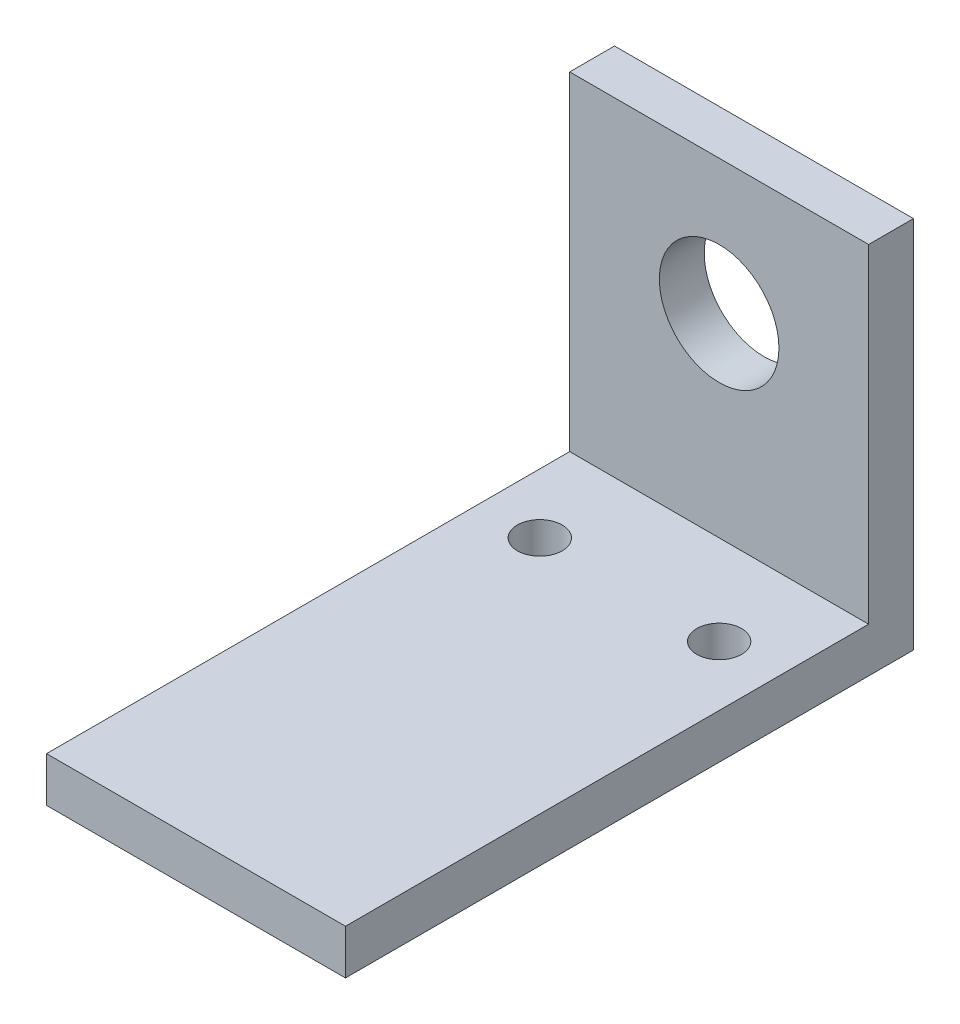
ISO-10303-21;
HEADER;
FILE_DESCRIPTION(('STEP AP214'),'2;1');
FILE_NAME('part.step','',(''),(''),'','','');
FILE_SCHEMA(('AUTOMOTIVE_DESIGN { 1 0 10303 214 1 1 1 1 }'));
ENDSEC;
DATA;
#1=APPLICATION_CONTEXT('core data for automotive mechanical design processes');
#2=APPLICATION_PROTOCOL_DEFINITION('international standard','automotive_design',2000,#1);
#3=PRODUCT_CONTEXT('',#1,'mechanical');
#4=PRODUCT('Part','Part','',(#3));
#5=PRODUCT_RELATED_PRODUCT_CATEGORY('part','',(#4));
#6=PRODUCT_DEFINITION_FORMATION('','',#4);
#7=PRODUCT_DEFINITION_CONTEXT('part definition',#1,'design');
#8=PRODUCT_DEFINITION('design','',#6,#7);
#9=PRODUCT_DEFINITION_SHAPE('','',#8);
#10=(LENGTH_UNIT() NAMED_UNIT(*) SI_UNIT(.MILLI.,.METRE.));
#11=(NAMED_UNIT(*) PLANE_ANGLE_UNIT() SI_UNIT($,.RADIAN.));
#12=(NAMED_UNIT(*) SI_UNIT($,.STERADIAN.) SOLID_ANGLE_UNIT());
#13=UNCERTAINTY_MEASURE_WITH_UNIT(LENGTH_MEASURE(1.E-05),#10,'distance_accuracy_value','');
#14=(GEOMETRIC_REPRESENTATION_CONTEXT(3) GLOBAL_UNCERTAINTY_ASSIGNED_CONTEXT((#13)) GLOBAL_UNIT_ASSIGNED_CONTEXT((#10,
#11,#12)) REPRESENTATION_CONTEXT('',''));
#15=CARTESIAN_POINT('',(0.,0.,0.));
#16=DIRECTION('',(0.,0.,1.));
#17=DIRECTION('',(1.,0.,0.));
#18=AXIS2_PLACEMENT_3D('',#15,#16,#17);
#19=CARTESIAN_POINT('',(20.,0.,35.));
#20=DIRECTION('',(0.,-1.,0.));
#21=DIRECTION('',(0.,0.,-1.));
#22=AXIS2_PLACEMENT_3D('',#19,#20,#21);
#23=PLANE('',#22);
#24=CARTESIAN_POINT('',(16.,0.,6.));
#25=DIRECTION('',(0.,1.,0.));
#26=DIRECTION('',(0.,0.,1.));
#27=AXIS2_PLACEMENT_3D('',#24,#25,#26);
#28=CIRCLE('',#27,1.5);
#29=CARTESIAN_POINT('',(16.,0.,7.5));
#30=VERTEX_POINT('',#29);
#31=EDGE_CURVE('E162',#30,#30,#28,.T.);
#32=ORIENTED_EDGE('',*,*,#31,.F.);
#33=EDGE_LOOP('',(#32));
#34=FACE_BOUND('',#33,.T.);
#35=CARTESIAN_POINT('',(4.,0.,6.));
#36=DIRECTION('',(0.,1.,0.));
#37=DIRECTION('',(0.,0.,1.));
#38=AXIS2_PLACEMENT_3D('',#35,#36,#37);
#39=CIRCLE('',#38,1.5);
#40=CARTESIAN_POINT('',(4.,0.,7.5));
#41=VERTEX_POINT('',#40);
#42=EDGE_CURVE('E165',#41,#41,#39,.T.);
#43=ORIENTED_EDGE('',*,*,#42,.F.);
#44=EDGE_LOOP('',(#43));
#45=FACE_BOUND('',#44,.T.);
#46=DIRECTION('',(0.,0.,1.));
#47=VECTOR('',#46,1.);
#48=CARTESIAN_POINT('',(0.,0.,35.));
#49=LINE('',#48,#47);
#50=CARTESIAN_POINT('',(0.,0.,0.));
#51=VERTEX_POINT('',#50);
#52=CARTESIAN_POINT('',(0.,0.,35.));
#53=VERTEX_POINT('',#52);
#54=EDGE_CURVE('E117',#51,#53,#49,.T.);
#55=ORIENTED_EDGE('',*,*,#54,.T.);
#56=DIRECTION('',(-1.,0.,0.));
#57=VECTOR('',#56,1.);
#58=CARTESIAN_POINT('',(20.,0.,35.));
#59=LINE('',#58,#57);
#60=CARTESIAN_POINT('',(20.,0.,35.));
#61=VERTEX_POINT('',#60);
#62=EDGE_CURVE('E11',#61,#53,#59,.T.);
#63=ORIENTED_EDGE('',*,*,#62,.F.);
#64=DIRECTION('',(0.,0.,1.));
#65=VECTOR('',#64,1.);
#66=CARTESIAN_POINT('',(20.,0.,35.));
#67=LINE('',#66,#65);
#68=CARTESIAN_POINT('',(20.,0.,0.));
#69=VERTEX_POINT('',#68);
#70=EDGE_CURVE('E128',#69,#61,#67,.T.);
#71=ORIENTED_EDGE('',*,*,#70,.F.);
#72=DIRECTION('',(-1.,0.,0.));
#73=VECTOR('',#72,1.);
#74=CARTESIAN_POINT('',(20.,0.,0.));
#75=LINE('',#74,#73);
#76=EDGE_CURVE('E113',#69,#51,#75,.T.);
#77=ORIENTED_EDGE('',*,*,#76,.T.);
#78=EDGE_LOOP('',(#55,#63,#71,#77));
#79=FACE_BOUND('',#78,.T.);
#80=ADVANCED_FACE('F33',(#34,#45,#79),#23,.F.);
#81=CARTESIAN_POINT('',(20.,-3.00000000000001,35.));
#82=DIRECTION('',(0.,0.,-1.));
#83=DIRECTION('',(-1.,0.,0.));
#84=AXIS2_PLACEMENT_3D('',#81,#82,#83);
#85=PLANE('',#84);
#86=DIRECTION('',(0.,-1.,0.));
#87=VECTOR('',#86,1.);
#88=CARTESIAN_POINT('',(0.,-3.00000000000001,35.));
#89=LINE('',#88,#87);
#90=CARTESIAN_POINT('',(0.,-3.00000000000001,35.));
#91=VERTEX_POINT('',#90);
#92=EDGE_CURVE('E120',#53,#91,#89,.T.);
#93=ORIENTED_EDGE('',*,*,#92,.T.);
#94=DIRECTION('',(-1.,0.,0.));
#95=VECTOR('',#94,1.);
#96=CARTESIAN_POINT('',(20.,-3.00000000000001,35.));
#97=LINE('',#96,#95);
#98=CARTESIAN_POINT('',(20.,-3.00000000000001,35.));
#99=VERTEX_POINT('',#98);
#100=EDGE_CURVE('E41',#99,#91,#97,.T.);
#101=ORIENTED_EDGE('',*,*,#100,.F.);
#102=DIRECTION('',(0.,-1.,0.));
#103=VECTOR('',#102,1.);
#104=CARTESIAN_POINT('',(20.,-3.00000000000001,35.));
#105=LINE('',#104,#103);
#106=EDGE_CURVE('E86',#61,#99,#105,.T.);
#107=ORIENTED_EDGE('',*,*,#106,.F.);
#108=ORIENTED_EDGE('',*,*,#62,.T.);
#109=EDGE_LOOP('',(#93,#101,#107,#108));
#110=FACE_BOUND('',#109,.T.);
#111=ADVANCED_FACE('F154',(#110),#85,.F.);
#112=CARTESIAN_POINT('',(20.,-3.,-3.));
#113=DIRECTION('',(0.,1.,0.));
#114=DIRECTION('',(0.,0.,1.));
#115=AXIS2_PLACEMENT_3D('',#112,#113,#114);
#116=PLANE('',#115);
#117=CARTESIAN_POINT('',(16.,-3.,6.));
#118=DIRECTION('',(0.,1.,0.));
#119=DIRECTION('',(0.,0.,1.));
#120=AXIS2_PLACEMENT_3D('',#117,#118,#119);
#121=CIRCLE('',#120,1.5);
#122=CARTESIAN_POINT('',(16.,-3.,7.5));
#123=VERTEX_POINT('',#122);
#124=EDGE_CURVE('E168',#123,#123,#121,.F.);
#125=ORIENTED_EDGE('',*,*,#124,.F.);
#126=EDGE_LOOP('',(#125));
#127=FACE_BOUND('',#126,.T.);
#128=CARTESIAN_POINT('',(4.,-3.,6.));
#129=DIRECTION('',(0.,1.,0.));
#130=DIRECTION('',(0.,0.,1.));
#131=AXIS2_PLACEMENT_3D('',#128,#129,#130);
#132=CIRCLE('',#131,1.5);
#133=CARTESIAN_POINT('',(4.,-3.,7.5));
#134=VERTEX_POINT('',#133);
#135=EDGE_CURVE('E167',#134,#134,#132,.F.);
#136=ORIENTED_EDGE('',*,*,#135,.F.);
#137=EDGE_LOOP('',(#136));
#138=FACE_BOUND('',#137,.T.);
#139=DIRECTION('',(0.,0.,-1.));
#140=VECTOR('',#139,1.);
#141=CARTESIAN_POINT('',(0.,-3.,-3.));
#142=LINE('',#141,#140);
#143=CARTESIAN_POINT('',(0.,-3.,-3.));
#144=VERTEX_POINT('',#143);
#145=EDGE_CURVE('E123',#91,#144,#142,.T.);
#146=ORIENTED_EDGE('',*,*,#145,.T.);
#147=DIRECTION('',(-1.,0.,0.));
#148=VECTOR('',#147,1.);
#149=CARTESIAN_POINT('',(20.,-3.,-3.));
#150=LINE('',#149,#148);
#151=CARTESIAN_POINT('',(20.,-3.,-3.));
#152=VERTEX_POINT('',#151);
#153=EDGE_CURVE('E108',#152,#144,#150,.T.);
#154=ORIENTED_EDGE('',*,*,#153,.F.);
#155=DIRECTION('',(0.,0.,-1.));
#156=VECTOR('',#155,1.);
#157=CARTESIAN_POINT('',(20.,-3.,-3.));
#158=LINE('',#157,#156);
#159=EDGE_CURVE('E99',#99,#152,#158,.T.);
#160=ORIENTED_EDGE('',*,*,#159,.F.);
#161=ORIENTED_EDGE('',*,*,#100,.T.);
#162=EDGE_LOOP('',(#146,#154,#160,#161));
#163=FACE_BOUND('',#162,.T.);
#164=ADVANCED_FACE('F134',(#127,#138,#163),#116,.F.);
#165=CARTESIAN_POINT('',(20.,22.,-3.));
#166=DIRECTION('',(0.,0.,1.));
#167=DIRECTION('',(0.,-1.,0.));
#168=AXIS2_PLACEMENT_3D('',#165,#166,#167);
#169=PLANE('',#168);
#170=CARTESIAN_POINT('',(10.,13.,-3.));
#171=DIRECTION('',(0.,0.,1.));
#172=DIRECTION('',(0.,-1.,0.));
#173=AXIS2_PLACEMENT_3D('',#170,#171,#172);
#174=CIRCLE('',#173,4.);
#175=CARTESIAN_POINT('',(10.,9.,-3.));
#176=VERTEX_POINT('',#175);
#177=EDGE_CURVE('E121',#176,#176,#174,.F.);
#178=ORIENTED_EDGE('',*,*,#177,.F.);
#179=EDGE_LOOP('',(#178));
#180=FACE_BOUND('',#179,.T.);
#181=DIRECTION('',(0.,1.,0.));
#182=VECTOR('',#181,1.);
#183=CARTESIAN_POINT('',(0.,22.,-3.));
#184=LINE('',#183,#182);
#185=CARTESIAN_POINT('',(0.,22.,-3.));
#186=VERTEX_POINT('',#185);
#187=EDGE_CURVE('E107',#144,#186,#184,.T.);
#188=ORIENTED_EDGE('',*,*,#187,.T.);
#189=DIRECTION('',(-1.,0.,0.));
#190=VECTOR('',#189,1.);
#191=CARTESIAN_POINT('',(20.,22.,-3.));
#192=LINE('',#191,#190);
#193=CARTESIAN_POINT('',(20.,22.,-3.));
#194=VERTEX_POINT('',#193);
#195=EDGE_CURVE('E104',#194,#186,#192,.T.);
#196=ORIENTED_EDGE('',*,*,#195,.F.);
#197=DIRECTION('',(0.,1.,0.));
#198=VECTOR('',#197,1.);
#199=CARTESIAN_POINT('',(20.,22.,-3.));
#200=LINE('',#199,#198);
#201=EDGE_CURVE('E93',#152,#194,#200,.T.);
#202=ORIENTED_EDGE('',*,*,#201,.F.);
#203=ORIENTED_EDGE('',*,*,#153,.T.);
#204=EDGE_LOOP('',(#188,#196,#202,#203));
#205=FACE_BOUND('',#204,.T.);
#206=ADVANCED_FACE('F105',(#180,#205),#169,.F.);
#207=CARTESIAN_POINT('',(20.,22.,0.));
#208=DIRECTION('',(0.,-1.,0.));
#209=DIRECTION('',(0.,0.,-1.));
#210=AXIS2_PLACEMENT_3D('',#207,#208,#209);
#211=PLANE('',#210);
#212=DIRECTION('',(0.,0.,1.));
#213=VECTOR('',#212,1.);
#214=CARTESIAN_POINT('',(0.,22.,0.));
#215=LINE('',#214,#213);
#216=CARTESIAN_POINT('',(0.,22.,0.));
#217=VERTEX_POINT('',#216);
#218=EDGE_CURVE('E72',#186,#217,#215,.T.);
#219=ORIENTED_EDGE('',*,*,#218,.T.);
#220=DIRECTION('',(-1.,0.,0.));
#221=VECTOR('',#220,1.);
#222=CARTESIAN_POINT('',(20.,22.,0.));
#223=LINE('',#222,#221);
#224=CARTESIAN_POINT('',(20.,22.,0.));
#225=VERTEX_POINT('',#224);
#226=EDGE_CURVE('E109',#225,#217,#223,.T.);
#227=ORIENTED_EDGE('',*,*,#226,.F.);
#228=DIRECTION('',(0.,0.,1.));
#229=VECTOR('',#228,1.);
#230=CARTESIAN_POINT('',(20.,22.,0.));
#231=LINE('',#230,#229);
#232=EDGE_CURVE('E97',#194,#225,#231,.T.);
#233=ORIENTED_EDGE('',*,*,#232,.F.);
#234=ORIENTED_EDGE('',*,*,#195,.T.);
#235=EDGE_LOOP('',(#219,#227,#233,#234));
#236=FACE_BOUND('',#235,.T.);
#237=ADVANCED_FACE('F111',(#236),#211,.F.);
#238=CARTESIAN_POINT('',(20.,0.,0.));
#239=DIRECTION('',(0.,0.,-1.));
#240=DIRECTION('',(-1.,0.,0.));
#241=AXIS2_PLACEMENT_3D('',#238,#239,#240);
#242=PLANE('',#241);
#243=CARTESIAN_POINT('',(10.,13.,0.));
#244=DIRECTION('',(0.,0.,1.));
#245=DIRECTION('',(1.,0.,0.));
#246=AXIS2_PLACEMENT_3D('',#243,#244,#245);
#247=CIRCLE('',#246,4.);
#248=CARTESIAN_POINT('',(14.,13.,0.));
#249=VERTEX_POINT('',#248);
#250=EDGE_CURVE('E171',#249,#249,#247,.T.);
#251=ORIENTED_EDGE('',*,*,#250,.F.);
#252=EDGE_LOOP('',(#251));
#253=FACE_BOUND('',#252,.T.);
#254=DIRECTION('',(0.,-1.,0.));
#255=VECTOR('',#254,1.);
#256=CARTESIAN_POINT('',(0.,0.,0.));
#257=LINE('',#256,#255);
#258=EDGE_CURVE('E78',#217,#51,#257,.T.);
#259=ORIENTED_EDGE('',*,*,#258,.T.);
#260=ORIENTED_EDGE('',*,*,#76,.F.);
#261=DIRECTION('',(0.,-1.,0.));
#262=VECTOR('',#261,1.);
#263=CARTESIAN_POINT('',(20.,0.,0.));
#264=LINE('',#263,#262);
#265=EDGE_CURVE('E49',#225,#69,#264,.T.);
#266=ORIENTED_EDGE('',*,*,#265,.F.);
#267=ORIENTED_EDGE('',*,*,#226,.T.);
#268=EDGE_LOOP('',(#259,#260,#266,#267));
#269=FACE_BOUND('',#268,.T.);
#270=ADVANCED_FACE('F141',(#253,#269),#242,.F.);
#271=CARTESIAN_POINT('',(20.,0.,0.));
#272=DIRECTION('',(1.,0.,0.));
#273=DIRECTION('',(0.,0.,-1.));
#274=AXIS2_PLACEMENT_3D('',#271,#272,#273);
#275=PLANE('',#274);
#276=ORIENTED_EDGE('',*,*,#70,.T.);
#277=ORIENTED_EDGE('',*,*,#106,.T.);
#278=ORIENTED_EDGE('',*,*,#159,.T.);
#279=ORIENTED_EDGE('',*,*,#201,.T.);
#280=ORIENTED_EDGE('',*,*,#232,.T.);
#281=ORIENTED_EDGE('',*,*,#265,.T.);
#282=EDGE_LOOP('',(#276,#277,#278,#279,#280,#281));
#283=FACE_BOUND('',#282,.T.);
#284=ADVANCED_FACE('F95',(#283),#275,.T.);
#285=CARTESIAN_POINT('',(0.,0.,0.));
#286=DIRECTION('',(1.,0.,0.));
#287=DIRECTION('',(0.,0.,-1.));
#288=AXIS2_PLACEMENT_3D('',#285,#286,#287);
#289=PLANE('',#288);
#290=ORIENTED_EDGE('',*,*,#54,.F.);
#291=ORIENTED_EDGE('',*,*,#258,.F.);
#292=ORIENTED_EDGE('',*,*,#218,.F.);
#293=ORIENTED_EDGE('',*,*,#187,.F.);
#294=ORIENTED_EDGE('',*,*,#145,.F.);
#295=ORIENTED_EDGE('',*,*,#92,.F.);
#296=EDGE_LOOP('',(#290,#291,#292,#293,#294,#295));
#297=FACE_BOUND('',#296,.T.);
#298=ADVANCED_FACE('F137',(#297),#289,.F.);
#299=CARTESIAN_POINT('',(10.,13.,-3.001));
#300=DIRECTION('',(0.,0.,1.));
#301=DIRECTION('',(1.,0.,0.));
#302=AXIS2_PLACEMENT_3D('',#299,#300,#301);
#303=CYLINDRICAL_SURFACE('',#302,4.);
#304=ORIENTED_EDGE('',*,*,#250,.T.);
#305=EDGE_LOOP('',(#304));
#306=FACE_BOUND('',#305,.T.);
#307=ORIENTED_EDGE('',*,*,#177,.T.);
#308=EDGE_LOOP('',(#307));
#309=FACE_BOUND('',#308,.T.);
#310=ADVANCED_FACE('F184',(#306,#309),#303,.F.);
#311=CARTESIAN_POINT('',(4.,-3.00100000000001,6.));
#312=DIRECTION('',(0.,1.,0.));
#313=DIRECTION('',(0.,0.,1.));
#314=AXIS2_PLACEMENT_3D('',#311,#312,#313);
#315=CYLINDRICAL_SURFACE('',#314,1.5);
#316=ORIENTED_EDGE('',*,*,#42,.T.);
#317=EDGE_LOOP('',(#316));
#318=FACE_BOUND('',#317,.T.);
#319=ORIENTED_EDGE('',*,*,#135,.T.);
#320=EDGE_LOOP('',(#319));
#321=FACE_BOUND('',#320,.T.);
#322=ADVANCED_FACE('F199',(#318,#321),#315,.F.);
#323=CARTESIAN_POINT('',(16.,-3.00100000000001,6.));
#324=DIRECTION('',(0.,1.,0.));
#325=DIRECTION('',(0.,0.,1.));
#326=AXIS2_PLACEMENT_3D('',#323,#324,#325);
#327=CYLINDRICAL_SURFACE('',#326,1.5);
#328=ORIENTED_EDGE('',*,*,#31,.T.);
#329=EDGE_LOOP('',(#328));
#330=FACE_BOUND('',#329,.T.);
#331=ORIENTED_EDGE('',*,*,#124,.T.);
#332=EDGE_LOOP('',(#331));
#333=FACE_BOUND('',#332,.T.);
#334=ADVANCED_FACE('F201',(#330,#333),#327,.F.);
#335=CLOSED_SHELL('',(#80,#111,#164,#206,#237,#270,#284,#298,#310,#322,#334));
#336=MANIFOLD_SOLID_BREP('B2',#335);
#337=ADVANCED_BREP_SHAPE_REPRESENTATION('',(#18,#336),#14);
#338=SHAPE_DEFINITION_REPRESENTATION(#9,#337);
ENDSEC;
END-ISO-10303-21;
